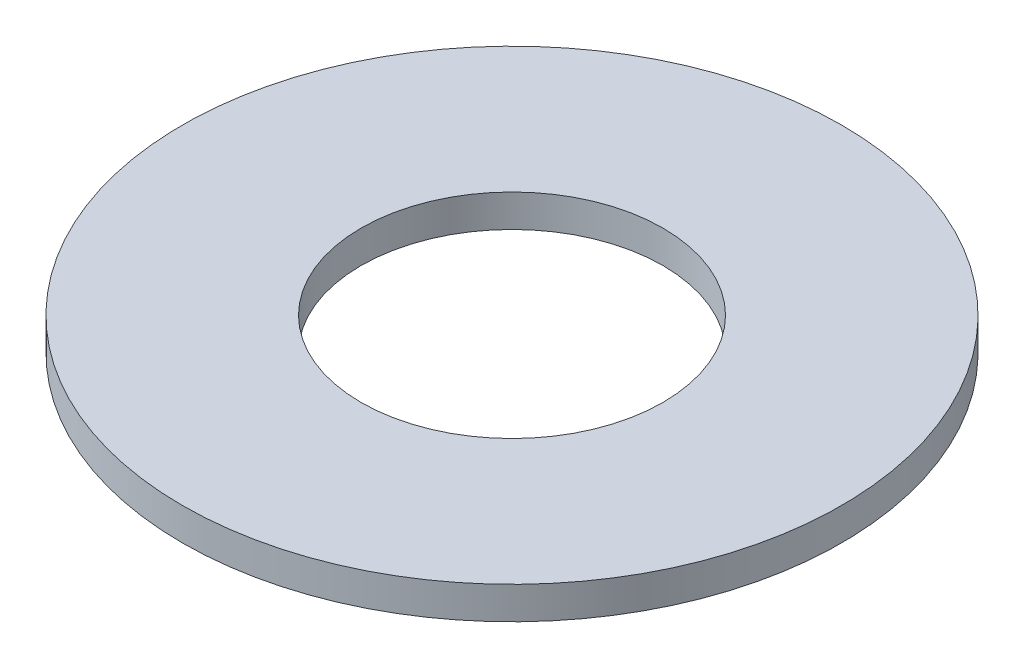
ISO-10303-21;
HEADER;
FILE_DESCRIPTION(('STEP AP214'),'2;1');
FILE_NAME('part.step','',(''),(''),'','','');
FILE_SCHEMA(('AUTOMOTIVE_DESIGN { 1 0 10303 214 1 1 1 1 }'));
ENDSEC;
DATA;
#1=APPLICATION_CONTEXT('core data for automotive mechanical design processes');
#2=APPLICATION_PROTOCOL_DEFINITION('international standard','automotive_design',2000,#1);
#3=PRODUCT_CONTEXT('',#1,'mechanical');
#4=PRODUCT('Part','Part','',(#3));
#5=PRODUCT_RELATED_PRODUCT_CATEGORY('part','',(#4));
#6=PRODUCT_DEFINITION_FORMATION('','',#4);
#7=PRODUCT_DEFINITION_CONTEXT('part definition',#1,'design');
#8=PRODUCT_DEFINITION('design','',#6,#7);
#9=PRODUCT_DEFINITION_SHAPE('','',#8);
#10=(LENGTH_UNIT() NAMED_UNIT(*) SI_UNIT(.MILLI.,.METRE.));
#11=(NAMED_UNIT(*) PLANE_ANGLE_UNIT() SI_UNIT($,.RADIAN.));
#12=(NAMED_UNIT(*) SI_UNIT($,.STERADIAN.) SOLID_ANGLE_UNIT());
#13=UNCERTAINTY_MEASURE_WITH_UNIT(LENGTH_MEASURE(1.E-05),#10,'distance_accuracy_value','');
#14=(GEOMETRIC_REPRESENTATION_CONTEXT(3) GLOBAL_UNCERTAINTY_ASSIGNED_CONTEXT((#13)) GLOBAL_UNIT_ASSIGNED_CONTEXT((#10,
#11,#12)) REPRESENTATION_CONTEXT('',''));
#15=CARTESIAN_POINT('',(0.,0.,0.));
#16=DIRECTION('',(0.,0.,1.));
#17=DIRECTION('',(1.,0.,0.));
#18=AXIS2_PLACEMENT_3D('',#15,#16,#17);
#19=CARTESIAN_POINT('',(0.,0.254,0.));
#20=DIRECTION('',(0.,1.,0.));
#21=DIRECTION('',(0.,0.,-1.));
#22=AXIS2_PLACEMENT_3D('',#19,#20,#21);
#23=PLANE('',#22);
#24=CARTESIAN_POINT('',(0.,0.254,0.));
#25=DIRECTION('',(0.,-1.,0.));
#26=DIRECTION('',(0.,0.,-1.));
#27=AXIS2_PLACEMENT_3D('',#24,#25,#26);
#28=CIRCLE('',#27,2.5781);
#29=CARTESIAN_POINT('',(0.,0.254,-2.5781));
#30=VERTEX_POINT('',#29);
#31=EDGE_CURVE('E10',#30,#30,#28,.T.);
#32=ORIENTED_EDGE('',*,*,#31,.F.);
#33=EDGE_LOOP('',(#32));
#34=FACE_BOUND('',#33,.T.);
#35=CARTESIAN_POINT('',(0.,0.254,0.));
#36=DIRECTION('',(0.,-1.,0.));
#37=DIRECTION('',(0.,0.,-1.));
#38=AXIS2_PLACEMENT_3D('',#35,#36,#37);
#39=CIRCLE('',#38,1.1811);
#40=CARTESIAN_POINT('',(0.,0.254,-1.1811));
#41=VERTEX_POINT('',#40);
#42=EDGE_CURVE('E44',#41,#41,#39,.T.);
#43=ORIENTED_EDGE('',*,*,#42,.T.);
#44=EDGE_LOOP('',(#43));
#45=FACE_BOUND('',#44,.T.);
#46=ADVANCED_FACE('F33',(#34,#45),#23,.T.);
#47=CARTESIAN_POINT('',(0.,0.,0.));
#48=DIRECTION('',(0.,1.,0.));
#49=DIRECTION('',(0.,0.,-1.));
#50=AXIS2_PLACEMENT_3D('',#47,#48,#49);
#51=PLANE('',#50);
#52=CARTESIAN_POINT('',(0.,0.,0.));
#53=DIRECTION('',(0.,-1.,0.));
#54=DIRECTION('',(0.,0.,-1.));
#55=AXIS2_PLACEMENT_3D('',#52,#53,#54);
#56=CIRCLE('',#55,2.5781);
#57=CARTESIAN_POINT('',(0.,0.,-2.5781));
#58=VERTEX_POINT('',#57);
#59=EDGE_CURVE('E37',#58,#58,#56,.T.);
#60=ORIENTED_EDGE('',*,*,#59,.T.);
#61=EDGE_LOOP('',(#60));
#62=FACE_BOUND('',#61,.T.);
#63=CARTESIAN_POINT('',(0.,0.,0.));
#64=DIRECTION('',(0.,-1.,0.));
#65=DIRECTION('',(0.,0.,-1.));
#66=AXIS2_PLACEMENT_3D('',#63,#64,#65);
#67=CIRCLE('',#66,1.1811);
#68=CARTESIAN_POINT('',(0.,0.,-1.1811));
#69=VERTEX_POINT('',#68);
#70=EDGE_CURVE('E46',#69,#69,#67,.T.);
#71=ORIENTED_EDGE('',*,*,#70,.F.);
#72=EDGE_LOOP('',(#71));
#73=FACE_BOUND('',#72,.T.);
#74=ADVANCED_FACE('F59',(#62,#73),#51,.F.);
#75=CARTESIAN_POINT('',(0.,0.254,0.));
#76=DIRECTION('',(0.,-1.,0.));
#77=DIRECTION('',(0.,0.,1.));
#78=AXIS2_PLACEMENT_3D('',#75,#76,#77);
#79=CYLINDRICAL_SURFACE('',#78,2.5781);
#80=ORIENTED_EDGE('',*,*,#31,.T.);
#81=EDGE_LOOP('',(#80));
#82=FACE_BOUND('',#81,.T.);
#83=ORIENTED_EDGE('',*,*,#59,.F.);
#84=EDGE_LOOP('',(#83));
#85=FACE_BOUND('',#84,.T.);
#86=ADVANCED_FACE('F35',(#82,#85),#79,.T.);
#87=CARTESIAN_POINT('',(0.,0.254,0.));
#88=DIRECTION('',(0.,-1.,0.));
#89=DIRECTION('',(0.,0.,1.));
#90=AXIS2_PLACEMENT_3D('',#87,#88,#89);
#91=CYLINDRICAL_SURFACE('',#90,1.1811);
#92=ORIENTED_EDGE('',*,*,#42,.F.);
#93=EDGE_LOOP('',(#92));
#94=FACE_BOUND('',#93,.T.);
#95=ORIENTED_EDGE('',*,*,#70,.T.);
#96=EDGE_LOOP('',(#95));
#97=FACE_BOUND('',#96,.T.);
#98=ADVANCED_FACE('F53',(#94,#97),#91,.F.);
#99=CLOSED_SHELL('',(#46,#74,#86,#98));
#100=MANIFOLD_SOLID_BREP('B2',#99);
#101=ADVANCED_BREP_SHAPE_REPRESENTATION('',(#18,#100),#14);
#102=SHAPE_DEFINITION_REPRESENTATION(#9,#101);
ENDSEC;
END-ISO-10303-21;
